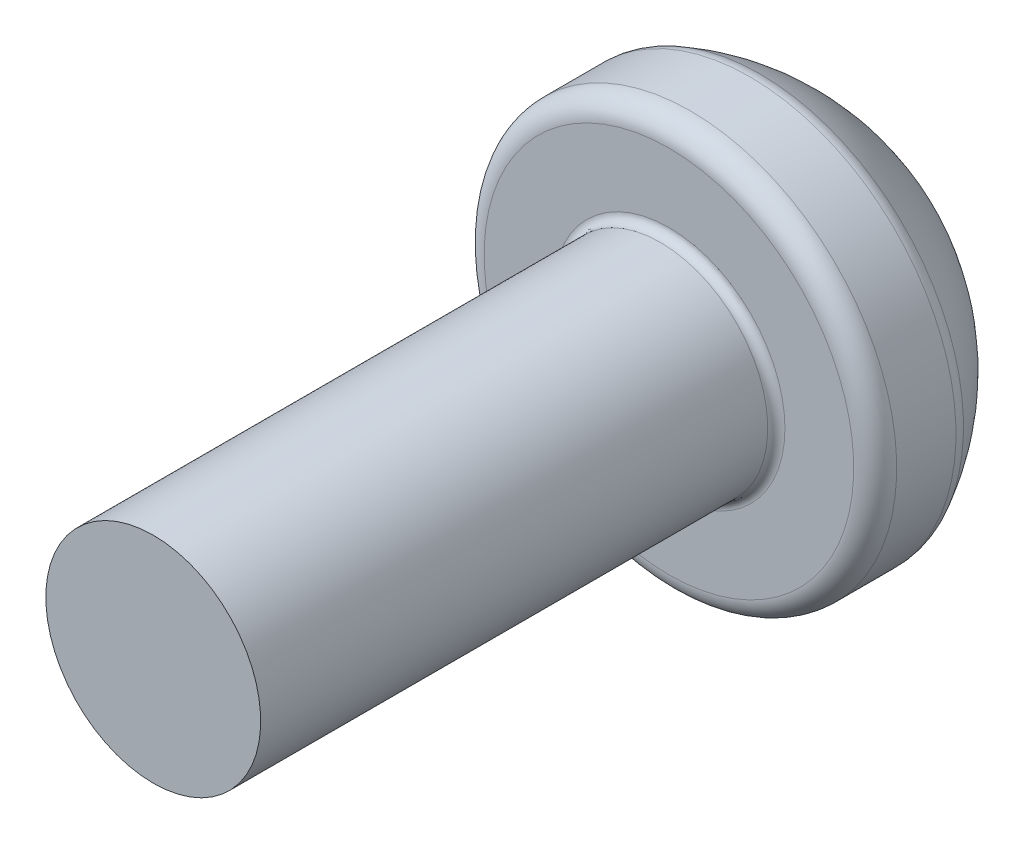
ISO-10303-21;
HEADER;
FILE_DESCRIPTION(('STEP AP214'),'2;1');
FILE_NAME('part.step','',(''),(''),'','','');
FILE_SCHEMA(('AUTOMOTIVE_DESIGN { 1 0 10303 214 1 1 1 1 }'));
ENDSEC;
DATA;
#1=APPLICATION_CONTEXT('core data for automotive mechanical design processes');
#2=APPLICATION_PROTOCOL_DEFINITION('international standard','automotive_design',2000,#1);
#3=PRODUCT_CONTEXT('',#1,'mechanical');
#4=PRODUCT('Part','Part','',(#3));
#5=PRODUCT_RELATED_PRODUCT_CATEGORY('part','',(#4));
#6=PRODUCT_DEFINITION_FORMATION('','',#4);
#7=PRODUCT_DEFINITION_CONTEXT('part definition',#1,'design');
#8=PRODUCT_DEFINITION('design','',#6,#7);
#9=PRODUCT_DEFINITION_SHAPE('','',#8);
#10=(LENGTH_UNIT() NAMED_UNIT(*) SI_UNIT(.MILLI.,.METRE.));
#11=(NAMED_UNIT(*) PLANE_ANGLE_UNIT() SI_UNIT($,.RADIAN.));
#12=(NAMED_UNIT(*) SI_UNIT($,.STERADIAN.) SOLID_ANGLE_UNIT());
#13=UNCERTAINTY_MEASURE_WITH_UNIT(LENGTH_MEASURE(1.E-05),#10,'distance_accuracy_value','');
#14=(GEOMETRIC_REPRESENTATION_CONTEXT(3) GLOBAL_UNCERTAINTY_ASSIGNED_CONTEXT((#13)) GLOBAL_UNIT_ASSIGNED_CONTEXT((#10,
#11,#12)) REPRESENTATION_CONTEXT('',''));
#15=CARTESIAN_POINT('',(0.,0.,0.));
#16=DIRECTION('',(0.,0.,1.));
#17=DIRECTION('',(1.,0.,0.));
#18=AXIS2_PLACEMENT_3D('',#15,#16,#17);
#19=CARTESIAN_POINT('',(0.,0.,6.));
#20=DIRECTION('',(0.,0.,1.));
#21=DIRECTION('',(0.,-1.,0.));
#22=AXIS2_PLACEMENT_3D('',#19,#20,#21);
#23=PLANE('',#22);
#24=CARTESIAN_POINT('',(0.,0.,6.));
#25=DIRECTION('',(0.,0.,-1.));
#26=DIRECTION('',(0.,1.,0.));
#27=AXIS2_PLACEMENT_3D('',#24,#25,#26);
#28=CIRCLE('',#27,1.25);
#29=CARTESIAN_POINT('',(0.,1.25000000000002,6.));
#30=VERTEX_POINT('',#29);
#31=EDGE_CURVE('E265',#30,#30,#28,.T.);
#32=ORIENTED_EDGE('',*,*,#31,.F.);
#33=EDGE_LOOP('',(#32));
#34=FACE_BOUND('',#33,.T.);
#35=ADVANCED_FACE('F34',(#34),#23,.T.);
#36=CARTESIAN_POINT('',(0.,0.,-1.99999999999999));
#37=DIRECTION('',(0.,0.,-1.));
#38=DIRECTION('',(0.,1.,0.));
#39=AXIS2_PLACEMENT_3D('',#36,#37,#38);
#40=CYLINDRICAL_SURFACE('',#39,1.25);
#41=CARTESIAN_POINT('',(0.,0.,0.1));
#42=DIRECTION('',(0.,0.,1.));
#43=DIRECTION('',(0.,-1.,0.));
#44=AXIS2_PLACEMENT_3D('',#41,#42,#43);
#45=CIRCLE('',#44,1.25);
#46=CARTESIAN_POINT('',(0.,-1.25000000000001,0.1));
#47=VERTEX_POINT('',#46);
#48=EDGE_CURVE('E271',#47,#47,#45,.T.);
#49=ORIENTED_EDGE('',*,*,#48,.T.);
#50=EDGE_LOOP('',(#49));
#51=FACE_BOUND('',#50,.T.);
#52=ORIENTED_EDGE('',*,*,#31,.T.);
#53=EDGE_LOOP('',(#52));
#54=FACE_BOUND('',#53,.T.);
#55=ADVANCED_FACE('F309',(#51,#54),#40,.T.);
#56=CARTESIAN_POINT('',(0.,1.25000000000001,0.));
#57=DIRECTION('',(0.,0.,1.));
#58=DIRECTION('',(0.,-1.,0.));
#59=AXIS2_PLACEMENT_3D('',#56,#57,#58);
#60=PLANE('',#59);
#61=CARTESIAN_POINT('',(0.,0.,0.));
#62=DIRECTION('',(0.,0.,1.));
#63=DIRECTION('',(0.,-1.,0.));
#64=AXIS2_PLACEMENT_3D('',#61,#62,#63);
#65=CIRCLE('',#64,2.15);
#66=CARTESIAN_POINT('',(0.,-2.15,0.));
#67=VERTEX_POINT('',#66);
#68=EDGE_CURVE('E11',#67,#67,#65,.T.);
#69=ORIENTED_EDGE('',*,*,#68,.T.);
#70=EDGE_LOOP('',(#69));
#71=FACE_BOUND('',#70,.T.);
#72=CARTESIAN_POINT('',(0.,0.,0.));
#73=DIRECTION('',(0.,0.,1.));
#74=DIRECTION('',(0.,-1.,0.));
#75=AXIS2_PLACEMENT_3D('',#72,#73,#74);
#76=CIRCLE('',#75,1.35);
#77=CARTESIAN_POINT('',(0.,-1.35,0.));
#78=VERTEX_POINT('',#77);
#79=EDGE_CURVE('E268',#78,#78,#76,.F.);
#80=ORIENTED_EDGE('',*,*,#79,.T.);
#81=EDGE_LOOP('',(#80));
#82=FACE_BOUND('',#81,.T.);
#83=ADVANCED_FACE('F315',(#71,#82),#60,.T.);
#84=CARTESIAN_POINT('',(0.,0.,-1.99999999999999));
#85=DIRECTION('',(0.,0.,-1.));
#86=DIRECTION('',(0.,1.,0.));
#87=AXIS2_PLACEMENT_3D('',#84,#85,#86);
#88=CYLINDRICAL_SURFACE('',#87,2.4);
#89=CARTESIAN_POINT('',(0.,0.,-0.939716779629664));
#90=DIRECTION('',(0.,0.,1.));
#91=DIRECTION('',(0.,-1.,0.));
#92=AXIS2_PLACEMENT_3D('',#89,#90,#91);
#93=CIRCLE('',#92,2.4);
#94=CARTESIAN_POINT('',(0.,-2.39999999999999,-0.939716779629664));
#95=VERTEX_POINT('',#94);
#96=EDGE_CURVE('E42',#95,#95,#93,.T.);
#97=ORIENTED_EDGE('',*,*,#96,.T.);
#98=EDGE_LOOP('',(#97));
#99=FACE_BOUND('',#98,.T.);
#100=CARTESIAN_POINT('',(0.,0.,-0.249999999999992));
#101=DIRECTION('',(0.,0.,1.));
#102=DIRECTION('',(0.,-1.,0.));
#103=AXIS2_PLACEMENT_3D('',#100,#101,#102);
#104=CIRCLE('',#103,2.4);
#105=CARTESIAN_POINT('',(0.,-2.4,-0.249999999999992));
#106=VERTEX_POINT('',#105);
#107=EDGE_CURVE('E277',#106,#106,#104,.F.);
#108=ORIENTED_EDGE('',*,*,#107,.T.);
#109=EDGE_LOOP('',(#108));
#110=FACE_BOUND('',#109,.T.);
#111=ADVANCED_FACE('F282',(#99,#110),#88,.T.);
#112=CARTESIAN_POINT('',(0.,0.,0.194199999999998));
#113=DIRECTION('',(0.,0.,-1.));
#114=DIRECTION('',(0.,1.,0.));
#115=AXIS2_PLACEMENT_3D('',#112,#113,#114);
#116=SPHERICAL_SURFACE('',#115,2.68069275374855);
#117=CARTESIAN_POINT('',(0.,0.,-1.05634163666692));
#118=DIRECTION('',(0.,0.,1.));
#119=DIRECTION('',(0.,-1.,0.));
#120=AXIS2_PLACEMENT_3D('',#117,#118,#119);
#121=CIRCLE('',#120,2.37113037493985);
#122=CARTESIAN_POINT('',(0.,2.37113037493985,-1.05634163666692));
#123=VERTEX_POINT('',#122);
#124=EDGE_CURVE('E274',#123,#123,#121,.F.);
#125=CARTESIAN_POINT('',(0.,0.,-1.99999999999999));
#126=DIRECTION('',(0.,0.,-1.));
#127=DIRECTION('',(0.,1.,0.));
#128=AXIS2_PLACEMENT_3D('',#125,#126,#127);
#129=CIRCLE('',#128,1.54);
#130=CARTESIAN_POINT('',(0.,1.54,-1.99999999999999));
#131=VERTEX_POINT('',#130);
#132=EDGE_CURVE('E261',#131,#131,#129,.T.);
#133=CARTESIAN_POINT('',(0.,2.37113037493985,-1.05634163666692));
#134=CARTESIAN_POINT('',(0.,2.36496233821131,-1.06803676094616));
#135=CARTESIAN_POINT('',(0.,2.35870776249117,-1.0796862440655));
#136=CARTESIAN_POINT('',(0.,2.34602693211457,-1.10289139359935));
#137=CARTESIAN_POINT('',(0.,2.33960067745811,-1.11444706001385));
#138=CARTESIAN_POINT('',(0.,2.32657788825569,-1.137462041753));
#139=CARTESIAN_POINT('',(0.,2.31998135370975,-1.14892135707765));
#140=CARTESIAN_POINT('',(0.,2.3066194511287,-1.1717411288514));
#141=CARTESIAN_POINT('',(0.,2.29985408309359,-1.1831015853005));
#142=CARTESIAN_POINT('',(0.,2.28615599420093,-1.20572115170728));
#143=CARTESIAN_POINT('',(0.,2.27922327334336,-1.21698026166495));
#144=CARTESIAN_POINT('',(0.,2.2651919968365,-1.23939467005739));
#145=CARTESIAN_POINT('',(0.,2.25809344118721,-1.25054996849214));
#146=CARTESIAN_POINT('',(0.,2.24373204924237,-1.27275431143024));
#147=CARTESIAN_POINT('',(0.,2.23646921294684,-1.28380335593359));
#148=CARTESIAN_POINT('',(0.,2.22178084987522,-1.30579277189245));
#149=CARTESIAN_POINT('',(0.,2.21435532309914,-1.31673314334796));
#150=CARTESIAN_POINT('',(0.,2.19934320483832,-1.33850281788041));
#151=CARTESIAN_POINT('',(0.,2.19175661335357,-1.34933212095736));
#152=CARTESIAN_POINT('',(0.,2.17642402671519,-1.37087728772175));
#153=CARTESIAN_POINT('',(0.,2.16867803156156,-1.3815931514092));
#154=CARTESIAN_POINT('',(0.,2.15302833352466,-1.40290909322001));
#155=CARTESIAN_POINT('',(0.,2.14512463064139,-1.41350917134337));
#156=CARTESIAN_POINT('',(0.,2.12916124761392,-1.43459122120211));
#157=CARTESIAN_POINT('',(0.,2.12110156746971,-1.44507319293749));
#158=CARTESIAN_POINT('',(0.,2.10482799453926,-1.46591673505503));
#159=CARTESIAN_POINT('',(0.,2.09661410175302,-1.47627830543719));
#160=CARTESIAN_POINT('',(0.,2.08003390192139,-1.49687877624421));
#161=CARTESIAN_POINT('',(0.,2.07166759487599,-1.50711767666908));
#162=CARTESIAN_POINT('',(0.,2.05478439827908,-1.52747056581531));
#163=CARTESIAN_POINT('',(0.,2.04626750872758,-1.53758455453666));
#164=CARTESIAN_POINT('',(0.,2.02908501184067,-1.55768540587833));
#165=CARTESIAN_POINT('',(0.,2.02041940450527,-1.56767226849863));
#166=CARTESIAN_POINT('',(0.,2.00294136933363,-1.58751668107414));
#167=CARTESIAN_POINT('',(0.,1.9941289414974,-1.59737423102935));
#168=CARTESIAN_POINT('',(0.,1.97635919475265,-1.61695786002287));
#169=CARTESIAN_POINT('',(0.,1.96740187584413,-1.62668393906117));
#170=CARTESIAN_POINT('',(0.,1.9493443081064,-1.64600249675386));
#171=CARTESIAN_POINT('',(0.,1.94024405927719,-1.65559497540823));
#172=CARTESIAN_POINT('',(0.,1.92190262414329,-1.67464423211702));
#173=CARTESIAN_POINT('',(0.,1.91266143783862,-1.68410101017144));
#174=CARTESIAN_POINT('',(0.,1.89404015105646,-1.70287679517513));
#175=CARTESIAN_POINT('',(0.,1.88466005057898,-1.71219580212441));
#176=CARTESIAN_POINT('',(0.,1.86576298916831,-1.7306940045768));
#177=CARTESIAN_POINT('',(0.,1.85624602823512,-1.73987320007991));
#178=CARTESIAN_POINT('',(0.,1.83707732959487,-1.7580897699098));
#179=CARTESIAN_POINT('',(0.,1.8274255918878,-1.76712714423657));
#180=CARTESIAN_POINT('',(0.,1.80798945289038,-1.78505809303471));
#181=CARTESIAN_POINT('',(0.,1.79820505160001,-1.79395166750609));
#182=CARTESIAN_POINT('',(0.,1.77850572767181,-1.81159306939759));
#183=CARTESIAN_POINT('',(0.,1.76859080503397,-1.82034089681773));
#184=CARTESIAN_POINT('',(0.,1.74863260922598,-1.8376888893248));
#185=CARTESIAN_POINT('',(0.,1.73858933605584,-1.84628905441173));
#186=CARTESIAN_POINT('',(0.,1.7183766380907,-1.8633398392874));
#187=CARTESIAN_POINT('',(0.,1.70820721329571,-1.87179045907613));
#188=CARTESIAN_POINT('',(0.,1.68774443864321,-1.88854030318034));
#189=CARTESIAN_POINT('',(0.,1.67745108878569,-1.89683952749583));
#190=CARTESIAN_POINT('',(0.,1.65674271757358,-1.91328476344681));
#191=CARTESIAN_POINT('',(0.,1.64632769621899,-1.92143077508231));
#192=CARTESIAN_POINT('',(0.,1.62537826270076,-1.93756780267901));
#193=CARTESIAN_POINT('',(0.,1.61484385053712,-1.94555881864021));
#194=CARTESIAN_POINT('',(0.,1.59365794042496,-1.96138410333854));
#195=CARTESIAN_POINT('',(0.,1.58300644247643,-1.96921837207567));
#196=CARTESIAN_POINT('',(0.,1.56158869818568,-1.98472845439087));
#197=CARTESIAN_POINT('',(0.,1.55082245184346,-1.99240426796895));
#198=CARTESIAN_POINT('',(0.,1.54,-1.99999999999999));
#199=B_SPLINE_CURVE_WITH_KNOTS('',3,(#133,#134,#135,#136,#137,#138,#139,#140,#141,#142,#143,
#144,#145,#146,#147,#148,#149,#150,#151,#152,#153,#154,#155,#156,#157,#158,#159,#160,#161,#162,
#163,#164,#165,#166,#167,#168,#169,#170,#171,#172,#173,#174,#175,#176,#177,#178,#179,#180,#181,
#182,#183,#184,#185,#186,#187,#188,#189,#190,#191,#192,#193,#194,#195,#196,#197,#198),
.UNSPECIFIED.,.F.,.F.,(4,2,2,2,2,2,2,2,2,2,2,2,2,2,2,2,2,2,2,2,2,2,2,2,2,2,2,2,2,2,2,2,4),(0.,
0.0396655612265228,0.0793311224530455,0.118996683679568,0.158662244906091,0.198327806132614,
0.237993367359137,0.277658928585659,0.317324489812182,0.356990051038705,0.396655612265228,
0.43632117349175,0.475986734718273,0.515652295944796,0.555317857171319,0.594983418397842,
0.634648979624364,0.674314540850887,0.71398010207741,0.753645663303933,0.793311224530455,
0.832976785756978,0.872642346983501,0.912307908210024,0.951973469436547,0.991639030663069,
1.03130459188959,1.07097015311612,1.11063571434264,1.15030127556916,1.18996683679568,
1.22963239802221,1.26929795924873),.UNSPECIFIED.);
#200=EDGE_CURVE('BSEAM291',#123,#131,#199,.T.);
#201=ORIENTED_EDGE('',*,*,#124,.T.);
#202=ORIENTED_EDGE('',*,*,#132,.F.);
#203=ORIENTED_EDGE('',*,*,#200,.T.);
#204=ORIENTED_EDGE('',*,*,#200,.F.);
#205=EDGE_LOOP('',(#201,#203,#202,#204));
#206=FACE_BOUND('',#205,.T.);
#207=ADVANCED_FACE('F291',(#206),#116,.T.);
#208=CARTESIAN_POINT('',(0.,0.,-1.99999999999999));
#209=DIRECTION('',(0.,0.,-1.));
#210=DIRECTION('',(0.,1.,0.));
#211=AXIS2_PLACEMENT_3D('',#208,#209,#210);
#212=PLANE('',#211);
#213=CARTESIAN_POINT('',(0.,0.,-1.99999999999999));
#214=DIRECTION('',(0.,0.,-1.));
#215=DIRECTION('',(0.,1.,0.));
#216=AXIS2_PLACEMENT_3D('',#213,#214,#215);
#217=CIRCLE('',#216,1.4);
#218=CARTESIAN_POINT('',(0.217707917147314,-1.38296900283822,-2.));
#219=VERTEX_POINT('',#218);
#220=CARTESIAN_POINT('',(-0.217707917147369,-1.38296900283822,-1.99999999999999));
#221=VERTEX_POINT('',#220);
#222=EDGE_CURVE('E220',#219,#221,#217,.T.);
#223=ORIENTED_EDGE('',*,*,#222,.F.);
#224=CARTESIAN_POINT('',(0.807499999999954,-1.39863102711187,-1.99999999999999));
#225=DIRECTION('',(0.,0.,1.));
#226=DIRECTION('',(0.,1.,0.));
#227=AXIS2_PLACEMENT_3D('',#224,#225,#226);
#228=CIRCLE('',#227,0.59);
#229=CARTESIAN_POINT('',(1.08883233053058,-0.880025088273745,-2.));
#230=VERTEX_POINT('',#229);
#231=EDGE_CURVE('E218',#230,#219,#228,.T.);
#232=ORIENTED_EDGE('',*,*,#231,.F.);
#233=CARTESIAN_POINT('',(0.,0.,-1.99999999999999));
#234=DIRECTION('',(0.,0.,-1.));
#235=DIRECTION('',(0.,1.,0.));
#236=AXIS2_PLACEMENT_3D('',#233,#234,#235);
#237=CIRCLE('',#236,1.4);
#238=CARTESIAN_POINT('',(1.30654024767795,-0.50294391456452,-1.99999999999999));
#239=VERTEX_POINT('',#238);
#240=EDGE_CURVE('E215',#239,#230,#237,.T.);
#241=ORIENTED_EDGE('',*,*,#240,.F.);
#242=CARTESIAN_POINT('',(1.61499999999998,0.,-1.99999999999999));
#243=DIRECTION('',(0.,0.,1.));
#244=DIRECTION('',(0.,1.,0.));
#245=AXIS2_PLACEMENT_3D('',#242,#243,#244);
#246=CIRCLE('',#245,0.59);
#247=CARTESIAN_POINT('',(1.30654024767796,0.502943914564482,-1.99999999999999));
#248=VERTEX_POINT('',#247);
#249=EDGE_CURVE('E213',#248,#239,#246,.T.);
#250=ORIENTED_EDGE('',*,*,#249,.F.);
#251=CARTESIAN_POINT('',(0.,0.,-1.99999999999999));
#252=DIRECTION('',(0.,0.,-1.));
#253=DIRECTION('',(0.,1.,0.));
#254=AXIS2_PLACEMENT_3D('',#251,#252,#253);
#255=CIRCLE('',#254,1.4);
#256=CARTESIAN_POINT('',(1.08883233053061,0.880025088273728,-2.));
#257=VERTEX_POINT('',#256);
#258=EDGE_CURVE('E210',#257,#248,#255,.T.);
#259=ORIENTED_EDGE('',*,*,#258,.F.);
#260=CARTESIAN_POINT('',(0.807499999999975,1.39863102711188,-2.));
#261=DIRECTION('',(0.,0.,1.));
#262=DIRECTION('',(0.,1.,0.));
#263=AXIS2_PLACEMENT_3D('',#260,#261,#262);
#264=CIRCLE('',#263,0.59);
#265=CARTESIAN_POINT('',(0.217707917147307,1.38296900283823,-2.));
#266=VERTEX_POINT('',#265);
#267=EDGE_CURVE('E208',#266,#257,#264,.T.);
#268=ORIENTED_EDGE('',*,*,#267,.F.);
#269=CARTESIAN_POINT('',(0.,0.,-1.99999999999999));
#270=DIRECTION('',(0.,0.,-1.));
#271=DIRECTION('',(0.,1.,0.));
#272=AXIS2_PLACEMENT_3D('',#269,#270,#271);
#273=CIRCLE('',#272,1.4);
#274=CARTESIAN_POINT('',(-0.21770791714739,1.38296900283822,-2.));
#275=VERTEX_POINT('',#274);
#276=EDGE_CURVE('E205',#275,#266,#273,.T.);
#277=ORIENTED_EDGE('',*,*,#276,.F.);
#278=CARTESIAN_POINT('',(-0.8075000000001,1.39863102711186,-2.));
#279=DIRECTION('',(0.,0.,1.));
#280=DIRECTION('',(0.,1.,0.));
#281=AXIS2_PLACEMENT_3D('',#278,#279,#280);
#282=CIRCLE('',#281,0.59);
#283=CARTESIAN_POINT('',(-1.08883233053075,0.880025088273707,-2.));
#284=VERTEX_POINT('',#283);
#285=EDGE_CURVE('E203',#284,#275,#282,.T.);
#286=ORIENTED_EDGE('',*,*,#285,.F.);
#287=CARTESIAN_POINT('',(0.,0.,-1.99999999999999));
#288=DIRECTION('',(0.,0.,-1.));
#289=DIRECTION('',(0.,1.,0.));
#290=AXIS2_PLACEMENT_3D('',#287,#288,#289);
#291=CIRCLE('',#290,1.4);
#292=CARTESIAN_POINT('',(-1.30654024767803,0.502943914564503,-2.));
#293=VERTEX_POINT('',#292);
#294=EDGE_CURVE('E201',#293,#284,#291,.T.);
#295=ORIENTED_EDGE('',*,*,#294,.F.);
#296=CARTESIAN_POINT('',(-1.61500000000011,0.,-2.));
#297=DIRECTION('',(0.,0.,1.));
#298=DIRECTION('',(0.,1.,0.));
#299=AXIS2_PLACEMENT_3D('',#296,#297,#298);
#300=CIRCLE('',#299,0.59);
#301=CARTESIAN_POINT('',(-1.30654024767804,-0.502943914564499,-1.99999999999999));
#302=VERTEX_POINT('',#301);
#303=EDGE_CURVE('E161',#302,#293,#300,.T.);
#304=ORIENTED_EDGE('',*,*,#303,.F.);
#305=CARTESIAN_POINT('',(0.,0.,-1.99999999999999));
#306=DIRECTION('',(0.,0.,-1.));
#307=DIRECTION('',(0.,1.,0.));
#308=AXIS2_PLACEMENT_3D('',#305,#306,#307);
#309=CIRCLE('',#308,1.4);
#310=CARTESIAN_POINT('',(-1.08883233053067,-0.880025088273732,-1.99999999999999));
#311=VERTEX_POINT('',#310);
#312=EDGE_CURVE('E157',#311,#302,#309,.T.);
#313=ORIENTED_EDGE('',*,*,#312,.F.);
#314=CARTESIAN_POINT('',(-0.807500000000044,-1.39863102711187,-2.));
#315=DIRECTION('',(0.,0.,1.));
#316=DIRECTION('',(0.,1.,0.));
#317=AXIS2_PLACEMENT_3D('',#314,#315,#316);
#318=CIRCLE('',#317,0.59);
#319=EDGE_CURVE('E223',#221,#311,#318,.T.);
#320=ORIENTED_EDGE('',*,*,#319,.F.);
#321=EDGE_LOOP('',(#223,#232,#241,#250,#259,#268,#277,#286,#295,#304,#313,#320));
#322=FACE_BOUND('',#321,.T.);
#323=ORIENTED_EDGE('',*,*,#132,.T.);
#324=EDGE_LOOP('',(#323));
#325=FACE_BOUND('',#324,.T.);
#326=ADVANCED_FACE('F294',(#322,#325),#212,.T.);
#327=CARTESIAN_POINT('',(0.,0.,0.1));
#328=DIRECTION('',(0.,0.,1.));
#329=DIRECTION('',(0.,-1.,0.));
#330=AXIS2_PLACEMENT_3D('',#327,#328,#329);
#331=TOROIDAL_SURFACE('',#330,1.35,0.1);
#332=ORIENTED_EDGE('',*,*,#48,.F.);
#333=EDGE_LOOP('',(#332));
#334=FACE_BOUND('',#333,.T.);
#335=ORIENTED_EDGE('',*,*,#79,.F.);
#336=EDGE_LOOP('',(#335));
#337=FACE_BOUND('',#336,.T.);
#338=ADVANCED_FACE('F288',(#334,#337),#331,.F.);
#339=CARTESIAN_POINT('',(0.,0.,-0.939716779629664));
#340=DIRECTION('',(0.,0.,1.));
#341=DIRECTION('',(0.,-1.,0.));
#342=AXIS2_PLACEMENT_3D('',#339,#340,#341);
#343=TOROIDAL_SURFACE('',#342,2.15,0.25);
#344=ORIENTED_EDGE('',*,*,#96,.F.);
#345=EDGE_LOOP('',(#344));
#346=FACE_BOUND('',#345,.T.);
#347=ORIENTED_EDGE('',*,*,#124,.F.);
#348=EDGE_LOOP('',(#347));
#349=FACE_BOUND('',#348,.T.);
#350=ADVANCED_FACE('F285',(#346,#349),#343,.T.);
#351=CARTESIAN_POINT('',(0.,0.,-0.249999999999992));
#352=DIRECTION('',(0.,0.,1.));
#353=DIRECTION('',(0.,-1.,0.));
#354=AXIS2_PLACEMENT_3D('',#351,#352,#353);
#355=TOROIDAL_SURFACE('',#354,2.15,0.25);
#356=ORIENTED_EDGE('',*,*,#68,.F.);
#357=EDGE_LOOP('',(#356));
#358=FACE_BOUND('',#357,.T.);
#359=ORIENTED_EDGE('',*,*,#107,.F.);
#360=EDGE_LOOP('',(#359));
#361=FACE_BOUND('',#360,.T.);
#362=ADVANCED_FACE('F36',(#358,#361),#355,.T.);
#363=CARTESIAN_POINT('',(-1.61500000000011,0.,-1.));
#364=DIRECTION('',(0.,0.,-1.));
#365=DIRECTION('',(0.,1.,0.));
#366=AXIS2_PLACEMENT_3D('',#363,#364,#365);
#367=CYLINDRICAL_SURFACE('',#366,0.59);
#368=CARTESIAN_POINT('',(-1.61500000000011,0.,-1.));
#369=DIRECTION('',(0.,0.,1.));
#370=DIRECTION('',(0.,1.,0.));
#371=AXIS2_PLACEMENT_3D('',#368,#369,#370);
#372=CIRCLE('',#371,0.59);
#373=CARTESIAN_POINT('',(-1.30654024767803,-0.502943914564503,-0.999999999999993));
#374=VERTEX_POINT('',#373);
#375=CARTESIAN_POINT('',(-1.025,0.,-0.999999999999993));
#376=VERTEX_POINT('',#375);
#377=EDGE_CURVE('E156',#374,#376,#372,.T.);
#378=ORIENTED_EDGE('',*,*,#377,.F.);
#379=DIRECTION('',(0.,0.,-1.));
#380=VECTOR('',#379,1.);
#381=CARTESIAN_POINT('',(-1.30654024767803,-0.502943914564503,-0.999999999999993));
#382=LINE('',#381,#380);
#383=EDGE_CURVE('E227',#374,#302,#382,.T.);
#384=ORIENTED_EDGE('',*,*,#383,.T.);
#385=ORIENTED_EDGE('',*,*,#303,.T.);
#386=DIRECTION('',(0.,0.,-1.));
#387=VECTOR('',#386,1.);
#388=CARTESIAN_POINT('',(-1.30654024767807,0.502943914564492,-1.));
#389=LINE('',#388,#387);
#390=CARTESIAN_POINT('',(-1.30654024767807,0.502943914564492,-1.));
#391=VERTEX_POINT('',#390);
#392=EDGE_CURVE('E49',#391,#293,#389,.T.);
#393=ORIENTED_EDGE('',*,*,#392,.F.);
#394=EDGE_CURVE('E147',#376,#391,#372,.T.);
#395=ORIENTED_EDGE('',*,*,#394,.F.);
#396=EDGE_LOOP('',(#378,#384,#385,#393,#395));
#397=FACE_BOUND('',#396,.T.);
#398=ADVANCED_FACE('F159',(#397),#367,.T.);
#399=CARTESIAN_POINT('',(-0.807500000000093,-1.39863102711188,-0.999999999999995));
#400=DIRECTION('',(0.,0.,-1.));
#401=DIRECTION('',(0.,1.,0.));
#402=AXIS2_PLACEMENT_3D('',#399,#400,#401);
#403=CYLINDRICAL_SURFACE('',#402,0.59);
#404=CARTESIAN_POINT('',(-0.807500000000093,-1.39863102711188,-0.999999999999995));
#405=DIRECTION('',(0.,0.,1.));
#406=DIRECTION('',(0.,1.,0.));
#407=AXIS2_PLACEMENT_3D('',#404,#405,#406);
#408=CIRCLE('',#407,0.59);
#409=CARTESIAN_POINT('',(-0.217707917147369,-1.38296900283823,-1.));
#410=VERTEX_POINT('',#409);
#411=CARTESIAN_POINT('',(-0.512500000000068,-0.887676038879067,-0.999999999999993));
#412=VERTEX_POINT('',#411);
#413=EDGE_CURVE('E195',#410,#412,#408,.T.);
#414=ORIENTED_EDGE('',*,*,#413,.F.);
#415=DIRECTION('',(0.,0.,-1.));
#416=VECTOR('',#415,1.);
#417=CARTESIAN_POINT('',(-0.217707917147369,-1.38296900283823,-1.));
#418=LINE('',#417,#416);
#419=EDGE_CURVE('E233',#410,#221,#418,.T.);
#420=ORIENTED_EDGE('',*,*,#419,.T.);
#421=ORIENTED_EDGE('',*,*,#319,.T.);
#422=DIRECTION('',(0.,0.,-1.));
#423=VECTOR('',#422,1.);
#424=CARTESIAN_POINT('',(-1.08883233053066,-0.880025088273732,-0.999999999999993));
#425=LINE('',#424,#423);
#426=CARTESIAN_POINT('',(-1.08883233053066,-0.880025088273732,-0.999999999999993));
#427=VERTEX_POINT('',#426);
#428=EDGE_CURVE('E230',#427,#311,#425,.T.);
#429=ORIENTED_EDGE('',*,*,#428,.F.);
#430=EDGE_CURVE('E194',#412,#427,#408,.T.);
#431=ORIENTED_EDGE('',*,*,#430,.F.);
#432=EDGE_LOOP('',(#414,#420,#421,#429,#431));
#433=FACE_BOUND('',#432,.T.);
#434=ADVANCED_FACE('F366',(#433),#403,.T.);
#435=CARTESIAN_POINT('',(0.80749999999994,-1.39863102711189,-0.999999999999993));
#436=DIRECTION('',(0.,0.,-1.));
#437=DIRECTION('',(0.,1.,0.));
#438=AXIS2_PLACEMENT_3D('',#435,#436,#437);
#439=CYLINDRICAL_SURFACE('',#438,0.59);
#440=CARTESIAN_POINT('',(0.80749999999994,-1.39863102711189,-0.999999999999993));
#441=DIRECTION('',(0.,0.,1.));
#442=DIRECTION('',(0.,1.,0.));
#443=AXIS2_PLACEMENT_3D('',#440,#441,#442);
#444=CIRCLE('',#443,0.59);
#445=CARTESIAN_POINT('',(1.08883233053058,-0.880025088273752,-1.));
#446=VERTEX_POINT('',#445);
#447=CARTESIAN_POINT('',(0.512499999999992,-0.88767603887906,-0.999999999999993));
#448=VERTEX_POINT('',#447);
#449=EDGE_CURVE('E188',#446,#448,#444,.T.);
#450=ORIENTED_EDGE('',*,*,#449,.F.);
#451=DIRECTION('',(0.,0.,-1.));
#452=VECTOR('',#451,1.);
#453=CARTESIAN_POINT('',(1.08883233053058,-0.880025088273752,-1.));
#454=LINE('',#453,#452);
#455=EDGE_CURVE('E239',#446,#230,#454,.T.);
#456=ORIENTED_EDGE('',*,*,#455,.T.);
#457=ORIENTED_EDGE('',*,*,#231,.T.);
#458=DIRECTION('',(0.,0.,-1.));
#459=VECTOR('',#458,1.);
#460=CARTESIAN_POINT('',(0.217707917147307,-1.38296900283823,-0.999999999999995));
#461=LINE('',#460,#459);
#462=CARTESIAN_POINT('',(0.217707917147307,-1.38296900283823,-0.999999999999995));
#463=VERTEX_POINT('',#462);
#464=EDGE_CURVE('E236',#463,#219,#461,.T.);
#465=ORIENTED_EDGE('',*,*,#464,.F.);
#466=EDGE_CURVE('E187',#448,#463,#444,.T.);
#467=ORIENTED_EDGE('',*,*,#466,.F.);
#468=EDGE_LOOP('',(#450,#456,#457,#465,#467));
#469=FACE_BOUND('',#468,.T.);
#470=ADVANCED_FACE('F375',(#469),#439,.T.);
#471=CARTESIAN_POINT('',(1.61499999999996,0.,-0.999999999999993));
#472=DIRECTION('',(0.,0.,-1.));
#473=DIRECTION('',(0.,1.,0.));
#474=AXIS2_PLACEMENT_3D('',#471,#472,#473);
#475=CYLINDRICAL_SURFACE('',#474,0.59);
#476=CARTESIAN_POINT('',(1.61499999999996,0.,-0.999999999999993));
#477=DIRECTION('',(0.,0.,1.));
#478=DIRECTION('',(0.,1.,0.));
#479=AXIS2_PLACEMENT_3D('',#476,#477,#478);
#480=CIRCLE('',#479,0.59);
#481=CARTESIAN_POINT('',(1.30654024767801,0.502943914564492,-0.999999999999993));
#482=VERTEX_POINT('',#481);
#483=CARTESIAN_POINT('',(1.02499999999998,0.,-0.999999999999993));
#484=VERTEX_POINT('',#483);
#485=EDGE_CURVE('E181',#482,#484,#480,.T.);
#486=ORIENTED_EDGE('',*,*,#485,.F.);
#487=DIRECTION('',(0.,0.,-1.));
#488=VECTOR('',#487,1.);
#489=CARTESIAN_POINT('',(1.30654024767801,0.502943914564492,-0.999999999999993));
#490=LINE('',#489,#488);
#491=EDGE_CURVE('E245',#482,#248,#490,.T.);
#492=ORIENTED_EDGE('',*,*,#491,.T.);
#493=ORIENTED_EDGE('',*,*,#249,.T.);
#494=DIRECTION('',(0.,0.,-1.));
#495=VECTOR('',#494,1.);
#496=CARTESIAN_POINT('',(1.30654024767796,-0.502943914564524,-0.999999999999993));
#497=LINE('',#496,#495);
#498=CARTESIAN_POINT('',(1.30654024767796,-0.502943914564524,-0.999999999999993));
#499=VERTEX_POINT('',#498);
#500=EDGE_CURVE('E242',#499,#239,#497,.T.);
#501=ORIENTED_EDGE('',*,*,#500,.F.);
#502=EDGE_CURVE('E180',#484,#499,#480,.T.);
#503=ORIENTED_EDGE('',*,*,#502,.F.);
#504=EDGE_LOOP('',(#486,#492,#493,#501,#503));
#505=FACE_BOUND('',#504,.T.);
#506=ADVANCED_FACE('F385',(#505),#475,.T.);
#507=CARTESIAN_POINT('',(0.807499999999989,1.39863102711188,-1.00000000000001));
#508=DIRECTION('',(0.,0.,-1.));
#509=DIRECTION('',(0.,1.,0.));
#510=AXIS2_PLACEMENT_3D('',#507,#508,#509);
#511=CYLINDRICAL_SURFACE('',#510,0.59);
#512=CARTESIAN_POINT('',(0.807499999999989,1.39863102711188,-1.00000000000001));
#513=DIRECTION('',(0.,0.,1.));
#514=DIRECTION('',(0.,1.,0.));
#515=AXIS2_PLACEMENT_3D('',#512,#513,#514);
#516=CIRCLE('',#515,0.59);
#517=CARTESIAN_POINT('',(0.217707917147342,1.38296900283823,-1.));
#518=VERTEX_POINT('',#517);
#519=CARTESIAN_POINT('',(0.512499999999978,0.88767603887905,-1.));
#520=VERTEX_POINT('',#519);
#521=EDGE_CURVE('E57',#518,#520,#516,.T.);
#522=ORIENTED_EDGE('',*,*,#521,.F.);
#523=DIRECTION('',(0.,0.,-1.));
#524=VECTOR('',#523,1.);
#525=CARTESIAN_POINT('',(0.217707917147342,1.38296900283823,-1.));
#526=LINE('',#525,#524);
#527=EDGE_CURVE('E251',#518,#266,#526,.T.);
#528=ORIENTED_EDGE('',*,*,#527,.T.);
#529=ORIENTED_EDGE('',*,*,#267,.T.);
#530=DIRECTION('',(0.,0.,-1.));
#531=VECTOR('',#530,1.);
#532=CARTESIAN_POINT('',(1.08883233053061,0.880025088273714,-1.));
#533=LINE('',#532,#531);
#534=CARTESIAN_POINT('',(1.08883233053061,0.880025088273714,-1.));
#535=VERTEX_POINT('',#534);
#536=EDGE_CURVE('E248',#535,#257,#533,.T.);
#537=ORIENTED_EDGE('',*,*,#536,.F.);
#538=EDGE_CURVE('E175',#520,#535,#516,.T.);
#539=ORIENTED_EDGE('',*,*,#538,.F.);
#540=EDGE_LOOP('',(#522,#528,#529,#537,#539));
#541=FACE_BOUND('',#540,.T.);
#542=ADVANCED_FACE('F395',(#541),#511,.T.);
#543=CARTESIAN_POINT('',(-0.807500000000134,1.39863102711184,-1.));
#544=DIRECTION('',(0.,0.,-1.));
#545=DIRECTION('',(0.,1.,0.));
#546=AXIS2_PLACEMENT_3D('',#543,#544,#545);
#547=CYLINDRICAL_SURFACE('',#546,0.59);
#548=CARTESIAN_POINT('',(-0.807500000000134,1.39863102711184,-1.));
#549=DIRECTION('',(0.,0.,1.));
#550=DIRECTION('',(0.,1.,0.));
#551=AXIS2_PLACEMENT_3D('',#548,#549,#550);
#552=CIRCLE('',#551,0.59);
#553=CARTESIAN_POINT('',(-1.08883233053073,0.880025088273707,-0.999999999999998));
#554=VERTEX_POINT('',#553);
#555=CARTESIAN_POINT('',(-0.512500000000089,0.887676038879032,-1.));
#556=VERTEX_POINT('',#555);
#557=EDGE_CURVE('E170',#554,#556,#552,.T.);
#558=ORIENTED_EDGE('',*,*,#557,.F.);
#559=DIRECTION('',(0.,0.,-1.));
#560=VECTOR('',#559,1.);
#561=CARTESIAN_POINT('',(-1.08883233053073,0.880025088273707,-0.999999999999998));
#562=LINE('',#561,#560);
#563=EDGE_CURVE('E163',#554,#284,#562,.T.);
#564=ORIENTED_EDGE('',*,*,#563,.T.);
#565=ORIENTED_EDGE('',*,*,#285,.T.);
#566=DIRECTION('',(0.,0.,-1.));
#567=VECTOR('',#566,1.);
#568=CARTESIAN_POINT('',(-0.21770791714739,1.38296900283822,-1.));
#569=LINE('',#568,#567);
#570=CARTESIAN_POINT('',(-0.21770791714739,1.38296900283822,-1.));
#571=VERTEX_POINT('',#570);
#572=EDGE_CURVE('E254',#571,#275,#569,.T.);
#573=ORIENTED_EDGE('',*,*,#572,.F.);
#574=EDGE_CURVE('E168',#556,#571,#552,.T.);
#575=ORIENTED_EDGE('',*,*,#574,.F.);
#576=EDGE_LOOP('',(#558,#564,#565,#573,#575));
#577=FACE_BOUND('',#576,.T.);
#578=ADVANCED_FACE('F405',(#577),#547,.T.);
#579=CARTESIAN_POINT('',(-0.807500000000065,0.,-0.999999999999998));
#580=DIRECTION('',(0.,0.,-1.));
#581=DIRECTION('',(0.,1.,0.));
#582=AXIS2_PLACEMENT_3D('',#579,#580,#581);
#583=PLANE('',#582);
#584=CARTESIAN_POINT('',(0.,0.,-0.999999999999993));
#585=DIRECTION('',(0.,0.,-1.));
#586=DIRECTION('',(0.,1.,0.));
#587=AXIS2_PLACEMENT_3D('',#584,#585,#586);
#588=CIRCLE('',#587,1.025);
#589=EDGE_CURVE('E152',#376,#556,#588,.T.);
#590=ORIENTED_EDGE('',*,*,#589,.F.);
#591=ORIENTED_EDGE('',*,*,#394,.T.);
#592=CARTESIAN_POINT('',(0.,0.,-0.999999999999993));
#593=DIRECTION('',(0.,0.,-1.));
#594=DIRECTION('',(0.,1.,0.));
#595=AXIS2_PLACEMENT_3D('',#592,#593,#594);
#596=CIRCLE('',#595,1.4);
#597=EDGE_CURVE('E150',#391,#554,#596,.T.);
#598=ORIENTED_EDGE('',*,*,#597,.T.);
#599=ORIENTED_EDGE('',*,*,#557,.T.);
#600=EDGE_LOOP('',(#590,#591,#598,#599));
#601=FACE_BOUND('',#600,.T.);
#602=ADVANCED_FACE('F148',(#601),#583,.T.);
#603=EDGE_CURVE('E550',#412,#376,#588,.T.);
#604=ORIENTED_EDGE('',*,*,#603,.F.);
#605=ORIENTED_EDGE('',*,*,#430,.T.);
#606=CARTESIAN_POINT('',(0.,0.,-0.999999999999993));
#607=DIRECTION('',(0.,0.,-1.));
#608=DIRECTION('',(0.,1.,0.));
#609=AXIS2_PLACEMENT_3D('',#606,#607,#608);
#610=CIRCLE('',#609,1.4);
#611=EDGE_CURVE('E164',#427,#374,#610,.T.);
#612=ORIENTED_EDGE('',*,*,#611,.T.);
#613=ORIENTED_EDGE('',*,*,#377,.T.);
#614=EDGE_LOOP('',(#604,#605,#612,#613));
#615=FACE_BOUND('',#614,.T.);
#616=ADVANCED_FACE('F424',(#615),#583,.T.);
#617=EDGE_CURVE('E549',#448,#412,#588,.T.);
#618=ORIENTED_EDGE('',*,*,#617,.F.);
#619=ORIENTED_EDGE('',*,*,#466,.T.);
#620=CARTESIAN_POINT('',(0.,0.,-0.999999999999993));
#621=DIRECTION('',(0.,0.,-1.));
#622=DIRECTION('',(0.,1.,0.));
#623=AXIS2_PLACEMENT_3D('',#620,#621,#622);
#624=CIRCLE('',#623,1.4);
#625=EDGE_CURVE('E191',#463,#410,#624,.T.);
#626=ORIENTED_EDGE('',*,*,#625,.T.);
#627=ORIENTED_EDGE('',*,*,#413,.T.);
#628=EDGE_LOOP('',(#618,#619,#626,#627));
#629=FACE_BOUND('',#628,.T.);
#630=ADVANCED_FACE('F434',(#629),#583,.T.);
#631=EDGE_CURVE('E262',#484,#448,#588,.T.);
#632=ORIENTED_EDGE('',*,*,#631,.F.);
#633=ORIENTED_EDGE('',*,*,#502,.T.);
#634=CARTESIAN_POINT('',(0.,0.,-0.999999999999993));
#635=DIRECTION('',(0.,0.,-1.));
#636=DIRECTION('',(0.,1.,0.));
#637=AXIS2_PLACEMENT_3D('',#634,#635,#636);
#638=CIRCLE('',#637,1.4);
#639=EDGE_CURVE('E184',#499,#446,#638,.T.);
#640=ORIENTED_EDGE('',*,*,#639,.T.);
#641=ORIENTED_EDGE('',*,*,#449,.T.);
#642=EDGE_LOOP('',(#632,#633,#640,#641));
#643=FACE_BOUND('',#642,.T.);
#644=ADVANCED_FACE('F443',(#643),#583,.T.);
#645=EDGE_CURVE('E258',#520,#484,#588,.T.);
#646=ORIENTED_EDGE('',*,*,#645,.F.);
#647=ORIENTED_EDGE('',*,*,#538,.T.);
#648=CARTESIAN_POINT('',(0.,0.,-0.999999999999993));
#649=DIRECTION('',(0.,0.,-1.));
#650=DIRECTION('',(0.,1.,0.));
#651=AXIS2_PLACEMENT_3D('',#648,#649,#650);
#652=CIRCLE('',#651,1.4);
#653=EDGE_CURVE('E177',#535,#482,#652,.T.);
#654=ORIENTED_EDGE('',*,*,#653,.T.);
#655=ORIENTED_EDGE('',*,*,#485,.T.);
#656=EDGE_LOOP('',(#646,#647,#654,#655));
#657=FACE_BOUND('',#656,.T.);
#658=ADVANCED_FACE('F452',(#657),#583,.T.);
#659=EDGE_CURVE('E229',#556,#520,#588,.T.);
#660=ORIENTED_EDGE('',*,*,#659,.F.);
#661=ORIENTED_EDGE('',*,*,#574,.T.);
#662=CARTESIAN_POINT('',(0.,0.,-0.999999999999993));
#663=DIRECTION('',(0.,0.,-1.));
#664=DIRECTION('',(0.,1.,0.));
#665=AXIS2_PLACEMENT_3D('',#662,#663,#664);
#666=CIRCLE('',#665,1.4);
#667=EDGE_CURVE('E173',#571,#518,#666,.T.);
#668=ORIENTED_EDGE('',*,*,#667,.T.);
#669=ORIENTED_EDGE('',*,*,#521,.T.);
#670=EDGE_LOOP('',(#660,#661,#668,#669));
#671=FACE_BOUND('',#670,.T.);
#672=ADVANCED_FACE('F426',(#671),#583,.T.);
#673=CARTESIAN_POINT('',(0.,0.,-0.999999999999993));
#674=DIRECTION('',(0.,0.,-1.));
#675=DIRECTION('',(0.,1.,0.));
#676=AXIS2_PLACEMENT_3D('',#673,#674,#675);
#677=CYLINDRICAL_SURFACE('',#676,1.4);
#678=ORIENTED_EDGE('',*,*,#312,.T.);
#679=ORIENTED_EDGE('',*,*,#383,.F.);
#680=ORIENTED_EDGE('',*,*,#611,.F.);
#681=ORIENTED_EDGE('',*,*,#428,.T.);
#682=EDGE_LOOP('',(#678,#679,#680,#681));
#683=FACE_BOUND('',#682,.T.);
#684=ADVANCED_FACE('F469',(#683),#677,.F.);
#685=CARTESIAN_POINT('',(0.,0.,-0.999999999999993));
#686=DIRECTION('',(0.,0.,-1.));
#687=DIRECTION('',(0.,1.,0.));
#688=AXIS2_PLACEMENT_3D('',#685,#686,#687);
#689=CYLINDRICAL_SURFACE('',#688,1.4);
#690=ORIENTED_EDGE('',*,*,#222,.T.);
#691=ORIENTED_EDGE('',*,*,#419,.F.);
#692=ORIENTED_EDGE('',*,*,#625,.F.);
#693=ORIENTED_EDGE('',*,*,#464,.T.);
#694=EDGE_LOOP('',(#690,#691,#692,#693));
#695=FACE_BOUND('',#694,.T.);
#696=ADVANCED_FACE('F477',(#695),#689,.F.);
#697=CARTESIAN_POINT('',(0.,0.,-0.999999999999993));
#698=DIRECTION('',(0.,0.,-1.));
#699=DIRECTION('',(0.,1.,0.));
#700=AXIS2_PLACEMENT_3D('',#697,#698,#699);
#701=CYLINDRICAL_SURFACE('',#700,1.4);
#702=ORIENTED_EDGE('',*,*,#240,.T.);
#703=ORIENTED_EDGE('',*,*,#455,.F.);
#704=ORIENTED_EDGE('',*,*,#639,.F.);
#705=ORIENTED_EDGE('',*,*,#500,.T.);
#706=EDGE_LOOP('',(#702,#703,#704,#705));
#707=FACE_BOUND('',#706,.T.);
#708=ADVANCED_FACE('F487',(#707),#701,.F.);
#709=CARTESIAN_POINT('',(0.,0.,-0.999999999999993));
#710=DIRECTION('',(0.,0.,-1.));
#711=DIRECTION('',(0.,1.,0.));
#712=AXIS2_PLACEMENT_3D('',#709,#710,#711);
#713=CYLINDRICAL_SURFACE('',#712,1.4);
#714=ORIENTED_EDGE('',*,*,#258,.T.);
#715=ORIENTED_EDGE('',*,*,#491,.F.);
#716=ORIENTED_EDGE('',*,*,#653,.F.);
#717=ORIENTED_EDGE('',*,*,#536,.T.);
#718=EDGE_LOOP('',(#714,#715,#716,#717));
#719=FACE_BOUND('',#718,.T.);
#720=ADVANCED_FACE('F497',(#719),#713,.F.);
#721=CARTESIAN_POINT('',(0.,0.,-0.999999999999993));
#722=DIRECTION('',(0.,0.,-1.));
#723=DIRECTION('',(0.,1.,0.));
#724=AXIS2_PLACEMENT_3D('',#721,#722,#723);
#725=CYLINDRICAL_SURFACE('',#724,1.4);
#726=ORIENTED_EDGE('',*,*,#276,.T.);
#727=ORIENTED_EDGE('',*,*,#527,.F.);
#728=ORIENTED_EDGE('',*,*,#667,.F.);
#729=ORIENTED_EDGE('',*,*,#572,.T.);
#730=EDGE_LOOP('',(#726,#727,#728,#729));
#731=FACE_BOUND('',#730,.T.);
#732=ADVANCED_FACE('F507',(#731),#725,.F.);
#733=CARTESIAN_POINT('',(0.,0.,-0.999999999999993));
#734=DIRECTION('',(0.,0.,-1.));
#735=DIRECTION('',(0.,1.,0.));
#736=AXIS2_PLACEMENT_3D('',#733,#734,#735);
#737=CYLINDRICAL_SURFACE('',#736,1.4);
#738=ORIENTED_EDGE('',*,*,#294,.T.);
#739=ORIENTED_EDGE('',*,*,#563,.F.);
#740=ORIENTED_EDGE('',*,*,#597,.F.);
#741=ORIENTED_EDGE('',*,*,#392,.T.);
#742=EDGE_LOOP('',(#738,#739,#740,#741));
#743=FACE_BOUND('',#742,.T.);
#744=ADVANCED_FACE('F166',(#743),#737,.F.);
#745=CARTESIAN_POINT('',(0.,0.,-0.999999999999993));
#746=DIRECTION('',(0.,0.,-1.));
#747=DIRECTION('',(0.,1.,0.));
#748=AXIS2_PLACEMENT_3D('',#745,#746,#747);
#749=CONICAL_SURFACE('',#748,1.025,1.22173047639603);
#750=CARTESIAN_POINT('',(0.,0.,-0.626930509877139));
#751=VERTEX_POINT('',#750);
#752=VERTEX_LOOP('',#751);
#753=FACE_BOUND('',#752,.T.);
#754=ORIENTED_EDGE('',*,*,#645,.T.);
#755=ORIENTED_EDGE('',*,*,#631,.T.);
#756=ORIENTED_EDGE('',*,*,#617,.T.);
#757=ORIENTED_EDGE('',*,*,#603,.T.);
#758=ORIENTED_EDGE('',*,*,#589,.T.);
#759=ORIENTED_EDGE('',*,*,#659,.T.);
#760=EDGE_LOOP('',(#754,#755,#756,#757,#758,#759));
#761=FACE_BOUND('',#760,.T.);
#762=ADVANCED_FACE('F526',(#753,#761),#749,.F.);
#763=CLOSED_SHELL('',(#35,#55,#83,#111,#207,#326,#338,#350,#362,#398,#434,#470,#506,#542,#578,
#602,#616,#630,#644,#658,#672,#684,#696,#708,#720,#732,#744,#762));
#764=MANIFOLD_SOLID_BREP('B2',#763);
#765=ADVANCED_BREP_SHAPE_REPRESENTATION('',(#18,#764),#14);
#766=SHAPE_DEFINITION_REPRESENTATION(#9,#765);
ENDSEC;
END-ISO-10303-21;
